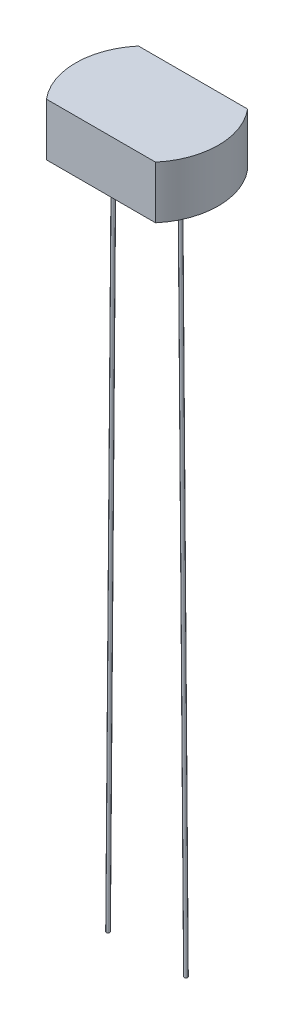
ISO-10303-21;
HEADER;
FILE_DESCRIPTION(('STEP AP214'),'2;1');
FILE_NAME('part.step','',(''),(''),'','','');
FILE_SCHEMA(('AUTOMOTIVE_DESIGN { 1 0 10303 214 1 1 1 1 }'));
ENDSEC;
DATA;
#1=APPLICATION_CONTEXT('core data for automotive mechanical design processes');
#2=APPLICATION_PROTOCOL_DEFINITION('international standard','automotive_design',2000,#1);
#3=PRODUCT_CONTEXT('',#1,'mechanical');
#4=PRODUCT('Part','Part','',(#3));
#5=PRODUCT_RELATED_PRODUCT_CATEGORY('part','',(#4));
#6=PRODUCT_DEFINITION_FORMATION('','',#4);
#7=PRODUCT_DEFINITION_CONTEXT('part definition',#1,'design');
#8=PRODUCT_DEFINITION('design','',#6,#7);
#9=PRODUCT_DEFINITION_SHAPE('','',#8);
#10=(LENGTH_UNIT() NAMED_UNIT(*) SI_UNIT(.MILLI.,.METRE.));
#11=(NAMED_UNIT(*) PLANE_ANGLE_UNIT() SI_UNIT($,.RADIAN.));
#12=(NAMED_UNIT(*) SI_UNIT($,.STERADIAN.) SOLID_ANGLE_UNIT());
#13=UNCERTAINTY_MEASURE_WITH_UNIT(LENGTH_MEASURE(1.E-05),#10,'distance_accuracy_value','');
#14=(GEOMETRIC_REPRESENTATION_CONTEXT(3) GLOBAL_UNCERTAINTY_ASSIGNED_CONTEXT((#13)) GLOBAL_UNIT_ASSIGNED_CONTEXT((#10,
#11,#12)) REPRESENTATION_CONTEXT('',''));
#15=CARTESIAN_POINT('',(0.,0.,0.));
#16=DIRECTION('',(0.,0.,1.));
#17=DIRECTION('',(1.,0.,0.));
#18=AXIS2_PLACEMENT_3D('',#15,#16,#17);
#19=CARTESIAN_POINT('',(0.,0.,0.));
#20=DIRECTION('',(0.,1.,0.));
#21=DIRECTION('',(0.,0.,1.));
#22=AXIS2_PLACEMENT_3D('',#19,#20,#21);
#23=PLANE('',#22);
#24=CARTESIAN_POINT('',(1.27,0.,0.));
#25=DIRECTION('',(0.,1.,0.));
#26=DIRECTION('',(0.,0.,-1.));
#27=AXIS2_PLACEMENT_3D('',#24,#25,#26);
#28=CIRCLE('',#27,0.0635);
#29=CARTESIAN_POINT('',(1.27,0.,-0.0635));
#30=VERTEX_POINT('',#29);
#31=EDGE_CURVE('E158',#30,#30,#28,.T.);
#32=ORIENTED_EDGE('',*,*,#31,.T.);
#33=EDGE_LOOP('',(#32));
#34=FACE_BOUND('',#33,.T.);
#35=CARTESIAN_POINT('',(0.,0.,0.));
#36=DIRECTION('',(0.,1.,0.));
#37=DIRECTION('',(0.,0.,1.));
#38=AXIS2_PLACEMENT_3D('',#35,#36,#37);
#39=CIRCLE('',#38,2.71442903756941);
#40=CARTESIAN_POINT('',(-2.07499999999999,0.,-1.75));
#41=VERTEX_POINT('',#40);
#42=CARTESIAN_POINT('',(-2.07499999999999,0.,1.75000000000003));
#43=VERTEX_POINT('',#42);
#44=EDGE_CURVE('E111',#41,#43,#39,.T.);
#45=ORIENTED_EDGE('',*,*,#44,.F.);
#46=DIRECTION('',(-1.,0.,0.));
#47=VECTOR('',#46,1.);
#48=CARTESIAN_POINT('',(-2.07499999999999,0.,-1.75));
#49=LINE('',#48,#47);
#50=CARTESIAN_POINT('',(2.07499999999999,0.,-1.75));
#51=VERTEX_POINT('',#50);
#52=EDGE_CURVE('E79',#51,#41,#49,.T.);
#53=ORIENTED_EDGE('',*,*,#52,.F.);
#54=CARTESIAN_POINT('',(0.,0.,0.));
#55=DIRECTION('',(0.,1.,0.));
#56=DIRECTION('',(0.,0.,1.));
#57=AXIS2_PLACEMENT_3D('',#54,#55,#56);
#58=CIRCLE('',#57,2.71442903756941);
#59=CARTESIAN_POINT('',(2.075,0.,1.75));
#60=VERTEX_POINT('',#59);
#61=EDGE_CURVE('E73',#60,#51,#58,.T.);
#62=ORIENTED_EDGE('',*,*,#61,.F.);
#63=DIRECTION('',(1.,0.,0.));
#64=VECTOR('',#63,1.);
#65=CARTESIAN_POINT('',(-2.07499999999999,0.,1.75000000000003));
#66=LINE('',#65,#64);
#67=EDGE_CURVE('E98',#43,#60,#66,.T.);
#68=ORIENTED_EDGE('',*,*,#67,.F.);
#69=EDGE_LOOP('',(#45,#53,#62,#68));
#70=FACE_BOUND('',#69,.T.);
#71=CARTESIAN_POINT('',(-1.26999999999999,0.,0.));
#72=DIRECTION('',(0.,-1.,0.));
#73=DIRECTION('',(0.,0.,-1.));
#74=AXIS2_PLACEMENT_3D('',#71,#72,#73);
#75=CIRCLE('',#74,0.0635);
#76=CARTESIAN_POINT('',(-1.26999999999999,0.,-0.0635));
#77=VERTEX_POINT('',#76);
#78=EDGE_CURVE('E11',#77,#77,#75,.T.);
#79=ORIENTED_EDGE('',*,*,#78,.F.);
#80=EDGE_LOOP('',(#79));
#81=FACE_BOUND('',#80,.T.);
#82=ADVANCED_FACE('F38',(#34,#70,#81),#23,.F.);
#83=CARTESIAN_POINT('',(0.,2.,0.));
#84=DIRECTION('',(0.,-1.,0.));
#85=DIRECTION('',(0.,0.,-1.));
#86=AXIS2_PLACEMENT_3D('',#83,#84,#85);
#87=CYLINDRICAL_SURFACE('',#86,2.71442903756941);
#88=ORIENTED_EDGE('',*,*,#44,.T.);
#89=DIRECTION('',(0.,-1.,0.));
#90=VECTOR('',#89,1.);
#91=CARTESIAN_POINT('',(-2.07499999999999,2.,1.75000000000003));
#92=LINE('',#91,#90);
#93=CARTESIAN_POINT('',(-2.07499999999999,2.,1.75000000000003));
#94=VERTEX_POINT('',#93);
#95=EDGE_CURVE('E48',#94,#43,#92,.T.);
#96=ORIENTED_EDGE('',*,*,#95,.F.);
#97=CARTESIAN_POINT('',(0.,2.,0.));
#98=DIRECTION('',(0.,1.,0.));
#99=DIRECTION('',(0.,0.,1.));
#100=AXIS2_PLACEMENT_3D('',#97,#98,#99);
#101=CIRCLE('',#100,2.71442903756941);
#102=CARTESIAN_POINT('',(-2.07499999999999,2.,-1.75));
#103=VERTEX_POINT('',#102);
#104=EDGE_CURVE('E92',#103,#94,#101,.T.);
#105=ORIENTED_EDGE('',*,*,#104,.F.);
#106=DIRECTION('',(0.,-1.,0.));
#107=VECTOR('',#106,1.);
#108=CARTESIAN_POINT('',(-2.07499999999999,2.,-1.75));
#109=LINE('',#108,#107);
#110=EDGE_CURVE('E107',#103,#41,#109,.T.);
#111=ORIENTED_EDGE('',*,*,#110,.T.);
#112=EDGE_LOOP('',(#88,#96,#105,#111));
#113=FACE_BOUND('',#112,.T.);
#114=ADVANCED_FACE('F40',(#113),#87,.T.);
#115=CARTESIAN_POINT('',(-2.07499999999999,2.,1.75000000000003));
#116=DIRECTION('',(0.,0.,-1.));
#117=DIRECTION('',(-1.,0.,0.));
#118=AXIS2_PLACEMENT_3D('',#115,#116,#117);
#119=PLANE('',#118);
#120=ORIENTED_EDGE('',*,*,#67,.T.);
#121=DIRECTION('',(0.,-1.,0.));
#122=VECTOR('',#121,1.);
#123=CARTESIAN_POINT('',(2.075,2.,1.75));
#124=LINE('',#123,#122);
#125=CARTESIAN_POINT('',(2.075,2.,1.75));
#126=VERTEX_POINT('',#125);
#127=EDGE_CURVE('E96',#126,#60,#124,.T.);
#128=ORIENTED_EDGE('',*,*,#127,.F.);
#129=DIRECTION('',(1.,0.,0.));
#130=VECTOR('',#129,1.);
#131=CARTESIAN_POINT('',(-2.07499999999999,2.,1.75000000000003));
#132=LINE('',#131,#130);
#133=EDGE_CURVE('E87',#94,#126,#132,.T.);
#134=ORIENTED_EDGE('',*,*,#133,.F.);
#135=ORIENTED_EDGE('',*,*,#95,.T.);
#136=EDGE_LOOP('',(#120,#128,#134,#135));
#137=FACE_BOUND('',#136,.T.);
#138=ADVANCED_FACE('F97',(#137),#119,.F.);
#139=CARTESIAN_POINT('',(0.,2.,0.));
#140=DIRECTION('',(0.,-1.,0.));
#141=DIRECTION('',(0.,0.,-1.));
#142=AXIS2_PLACEMENT_3D('',#139,#140,#141);
#143=CYLINDRICAL_SURFACE('',#142,2.71442903756941);
#144=ORIENTED_EDGE('',*,*,#61,.T.);
#145=DIRECTION('',(0.,-1.,0.));
#146=VECTOR('',#145,1.);
#147=CARTESIAN_POINT('',(2.07499999999999,2.,-1.75));
#148=LINE('',#147,#146);
#149=CARTESIAN_POINT('',(2.07499999999999,2.,-1.75));
#150=VERTEX_POINT('',#149);
#151=EDGE_CURVE('E100',#150,#51,#148,.T.);
#152=ORIENTED_EDGE('',*,*,#151,.F.);
#153=CARTESIAN_POINT('',(0.,2.,0.));
#154=DIRECTION('',(0.,1.,0.));
#155=DIRECTION('',(0.,0.,1.));
#156=AXIS2_PLACEMENT_3D('',#153,#154,#155);
#157=CIRCLE('',#156,2.71442903756941);
#158=EDGE_CURVE('E90',#126,#150,#157,.T.);
#159=ORIENTED_EDGE('',*,*,#158,.F.);
#160=ORIENTED_EDGE('',*,*,#127,.T.);
#161=EDGE_LOOP('',(#144,#152,#159,#160));
#162=FACE_BOUND('',#161,.T.);
#163=ADVANCED_FACE('F102',(#162),#143,.T.);
#164=CARTESIAN_POINT('',(-2.07499999999999,2.,-1.75));
#165=DIRECTION('',(0.,0.,1.));
#166=DIRECTION('',(1.,0.,0.));
#167=AXIS2_PLACEMENT_3D('',#164,#165,#166);
#168=PLANE('',#167);
#169=ORIENTED_EDGE('',*,*,#52,.T.);
#170=ORIENTED_EDGE('',*,*,#110,.F.);
#171=DIRECTION('',(-1.,0.,0.));
#172=VECTOR('',#171,1.);
#173=CARTESIAN_POINT('',(-2.07499999999999,2.,-1.75));
#174=LINE('',#173,#172);
#175=EDGE_CURVE('E56',#150,#103,#174,.T.);
#176=ORIENTED_EDGE('',*,*,#175,.F.);
#177=ORIENTED_EDGE('',*,*,#151,.T.);
#178=EDGE_LOOP('',(#169,#170,#176,#177));
#179=FACE_BOUND('',#178,.T.);
#180=ADVANCED_FACE('F148',(#179),#168,.F.);
#181=CARTESIAN_POINT('',(0.,2.,0.));
#182=DIRECTION('',(0.,1.,0.));
#183=DIRECTION('',(0.,0.,1.));
#184=AXIS2_PLACEMENT_3D('',#181,#182,#183);
#185=PLANE('',#184);
#186=ORIENTED_EDGE('',*,*,#104,.T.);
#187=ORIENTED_EDGE('',*,*,#133,.T.);
#188=ORIENTED_EDGE('',*,*,#158,.T.);
#189=ORIENTED_EDGE('',*,*,#175,.T.);
#190=EDGE_LOOP('',(#186,#187,#188,#189));
#191=FACE_BOUND('',#190,.T.);
#192=ADVANCED_FACE('F88',(#191),#185,.T.);
#193=CARTESIAN_POINT('',(-1.481,-26.,0.));
#194=DIRECTION('',(0.,-1.,0.));
#195=DIRECTION('',(0.,0.,-1.));
#196=AXIS2_PLACEMENT_3D('',#193,#194,#195);
#197=CIRCLE('',#196,0.0635);
#198=DIRECTION('',(0.00811511739112939,0.999967071892733,0.));
#199=VECTOR('',#198,1.);
#200=SURFACE_OF_LINEAR_EXTRUSION('',#197,#199);
#201=CARTESIAN_POINT('',(-1.481,-26.,-0.0635));
#202=VERTEX_POINT('',#201);
#203=EDGE_CURVE('E115',#202,#202,#197,.T.);
#204=ORIENTED_EDGE('',*,*,#203,.F.);
#205=EDGE_LOOP('',(#204));
#206=FACE_BOUND('',#205,.T.);
#207=ORIENTED_EDGE('',*,*,#78,.T.);
#208=EDGE_LOOP('',(#207));
#209=FACE_BOUND('',#208,.T.);
#210=ADVANCED_FACE('F136',(#206,#209),#200,.F.);
#211=CARTESIAN_POINT('',(-1.481,-26.,0.));
#212=DIRECTION('',(0.,-1.,0.));
#213=DIRECTION('',(0.,0.,-1.));
#214=AXIS2_PLACEMENT_3D('',#211,#212,#213);
#215=PLANE('',#214);
#216=ORIENTED_EDGE('',*,*,#203,.T.);
#217=EDGE_LOOP('',(#216));
#218=FACE_BOUND('',#217,.T.);
#219=ADVANCED_FACE('F138',(#218),#215,.T.);
#220=CARTESIAN_POINT('',(1.481,-26.,0.));
#221=DIRECTION('',(0.,1.,0.));
#222=DIRECTION('',(0.,0.,-1.));
#223=AXIS2_PLACEMENT_3D('',#220,#221,#222);
#224=CIRCLE('',#223,0.0635);
#225=DIRECTION('',(-0.00811511739112931,0.999967071892733,0.));
#226=VECTOR('',#225,1.);
#227=SURFACE_OF_LINEAR_EXTRUSION('',#224,#226);
#228=CARTESIAN_POINT('',(1.481,-26.,-0.0634999999999723));
#229=VERTEX_POINT('',#228);
#230=EDGE_CURVE('E157',#229,#229,#224,.T.);
#231=ORIENTED_EDGE('',*,*,#230,.T.);
#232=EDGE_LOOP('',(#231));
#233=FACE_BOUND('',#232,.T.);
#234=ORIENTED_EDGE('',*,*,#31,.F.);
#235=EDGE_LOOP('',(#234));
#236=FACE_BOUND('',#235,.T.);
#237=ADVANCED_FACE('F145',(#233,#236),#227,.T.);
#238=CARTESIAN_POINT('',(1.481,-26.,0.));
#239=DIRECTION('',(0.,-1.,0.));
#240=DIRECTION('',(0.,0.,-1.));
#241=AXIS2_PLACEMENT_3D('',#238,#239,#240);
#242=PLANE('',#241);
#243=ORIENTED_EDGE('',*,*,#230,.F.);
#244=EDGE_LOOP('',(#243));
#245=FACE_BOUND('',#244,.T.);
#246=ADVANCED_FACE('F177',(#245),#242,.T.);
#247=CLOSED_SHELL('',(#82,#114,#138,#163,#180,#192,#210,#219,#237,#246));
#248=MANIFOLD_SOLID_BREP('B2',#247);
#249=ADVANCED_BREP_SHAPE_REPRESENTATION('',(#18,#248),#14);
#250=SHAPE_DEFINITION_REPRESENTATION(#9,#249);
ENDSEC;
END-ISO-10303-21;
